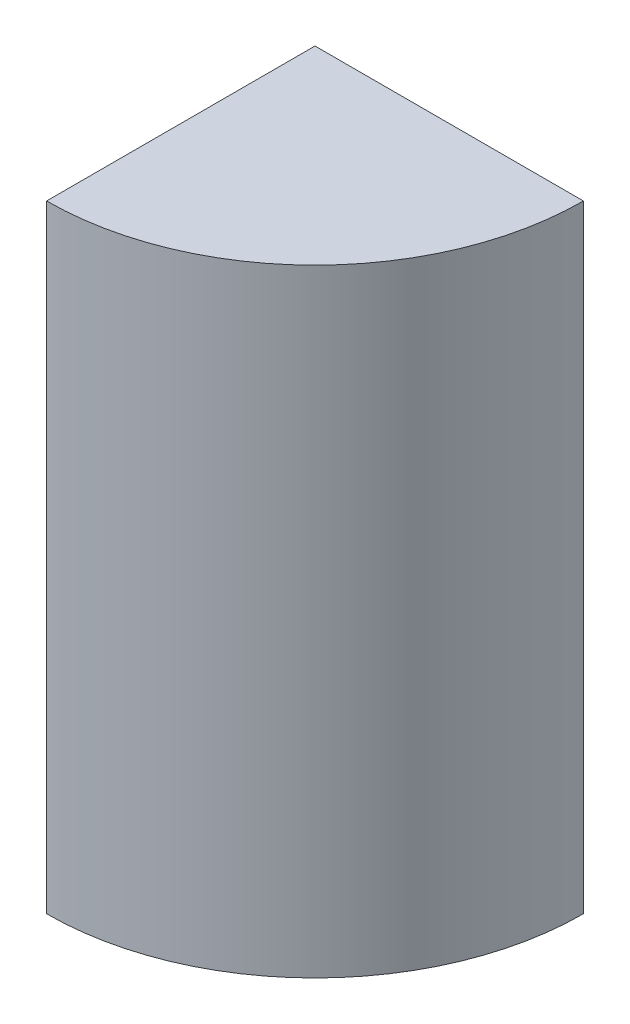
ISO-10303-21;
HEADER;
FILE_DESCRIPTION(('STEP AP214'),'2;1');
FILE_NAME('part.step','',(''),(''),'','','');
FILE_SCHEMA(('AUTOMOTIVE_DESIGN { 1 0 10303 214 1 1 1 1 }'));
ENDSEC;
DATA;
#1=APPLICATION_CONTEXT('core data for automotive mechanical design processes');
#2=APPLICATION_PROTOCOL_DEFINITION('international standard','automotive_design',2000,#1);
#3=PRODUCT_CONTEXT('',#1,'mechanical');
#4=PRODUCT('Part','Part','',(#3));
#5=PRODUCT_RELATED_PRODUCT_CATEGORY('part','',(#4));
#6=PRODUCT_DEFINITION_FORMATION('','',#4);
#7=PRODUCT_DEFINITION_CONTEXT('part definition',#1,'design');
#8=PRODUCT_DEFINITION('design','',#6,#7);
#9=PRODUCT_DEFINITION_SHAPE('','',#8);
#10=(LENGTH_UNIT() NAMED_UNIT(*) SI_UNIT(.MILLI.,.METRE.));
#11=(NAMED_UNIT(*) PLANE_ANGLE_UNIT() SI_UNIT($,.RADIAN.));
#12=(NAMED_UNIT(*) SI_UNIT($,.STERADIAN.) SOLID_ANGLE_UNIT());
#13=UNCERTAINTY_MEASURE_WITH_UNIT(LENGTH_MEASURE(1.E-05),#10,'distance_accuracy_value','');
#14=(GEOMETRIC_REPRESENTATION_CONTEXT(3) GLOBAL_UNCERTAINTY_ASSIGNED_CONTEXT((#13)) GLOBAL_UNIT_ASSIGNED_CONTEXT((#10,
#11,#12)) REPRESENTATION_CONTEXT('',''));
#15=CARTESIAN_POINT('',(0.,0.,0.));
#16=DIRECTION('',(0.,0.,1.));
#17=DIRECTION('',(1.,0.,0.));
#18=AXIS2_PLACEMENT_3D('',#15,#16,#17);
#19=CARTESIAN_POINT('',(0.,584.2,0.));
#20=DIRECTION('',(0.,-1.,0.));
#21=DIRECTION('',(0.,0.,-1.));
#22=AXIS2_PLACEMENT_3D('',#19,#20,#21);
#23=CYLINDRICAL_SURFACE('',#22,254.);
#24=CARTESIAN_POINT('',(0.,0.,0.));
#25=DIRECTION('',(0.,1.,0.));
#26=DIRECTION('',(0.,0.,1.));
#27=AXIS2_PLACEMENT_3D('',#24,#25,#26);
#28=CIRCLE('',#27,254.);
#29=CARTESIAN_POINT('',(254.,0.,0.));
#30=VERTEX_POINT('',#29);
#31=CARTESIAN_POINT('',(0.,0.,254.));
#32=VERTEX_POINT('',#31);
#33=EDGE_CURVE('E76',#30,#32,#28,.F.);
#34=ORIENTED_EDGE('',*,*,#33,.F.);
#35=DIRECTION('',(0.,-1.,0.));
#36=VECTOR('',#35,1.);
#37=CARTESIAN_POINT('',(254.,584.2,0.));
#38=LINE('',#37,#36);
#39=CARTESIAN_POINT('',(254.,584.2,0.));
#40=VERTEX_POINT('',#39);
#41=EDGE_CURVE('E11',#40,#30,#38,.T.);
#42=ORIENTED_EDGE('',*,*,#41,.F.);
#43=CARTESIAN_POINT('',(0.,584.2,0.));
#44=DIRECTION('',(0.,1.,0.));
#45=DIRECTION('',(0.,0.,1.));
#46=AXIS2_PLACEMENT_3D('',#43,#44,#45);
#47=CIRCLE('',#46,254.);
#48=CARTESIAN_POINT('',(0.,584.2,254.));
#49=VERTEX_POINT('',#48);
#50=EDGE_CURVE('E74',#40,#49,#47,.F.);
#51=ORIENTED_EDGE('',*,*,#50,.T.);
#52=DIRECTION('',(0.,-1.,0.));
#53=VECTOR('',#52,1.);
#54=CARTESIAN_POINT('',(0.,584.2,254.));
#55=LINE('',#54,#53);
#56=EDGE_CURVE('E72',#49,#32,#55,.T.);
#57=ORIENTED_EDGE('',*,*,#56,.T.);
#58=EDGE_LOOP('',(#34,#42,#51,#57));
#59=FACE_BOUND('',#58,.T.);
#60=ADVANCED_FACE('F39',(#59),#23,.T.);
#61=CARTESIAN_POINT('',(0.,584.2,0.));
#62=DIRECTION('',(0.,0.,-1.));
#63=DIRECTION('',(-1.,0.,0.));
#64=AXIS2_PLACEMENT_3D('',#61,#62,#63);
#65=PLANE('',#64);
#66=DIRECTION('',(1.,0.,0.));
#67=VECTOR('',#66,1.);
#68=CARTESIAN_POINT('',(0.,0.,0.));
#69=LINE('',#68,#67);
#70=CARTESIAN_POINT('',(0.,0.,0.));
#71=VERTEX_POINT('',#70);
#72=EDGE_CURVE('E90',#71,#30,#69,.T.);
#73=ORIENTED_EDGE('',*,*,#72,.F.);
#74=DIRECTION('',(0.,-1.,0.));
#75=VECTOR('',#74,1.);
#76=CARTESIAN_POINT('',(0.,584.2,0.));
#77=LINE('',#76,#75);
#78=CARTESIAN_POINT('',(0.,584.2,0.));
#79=VERTEX_POINT('',#78);
#80=EDGE_CURVE('E47',#79,#71,#77,.T.);
#81=ORIENTED_EDGE('',*,*,#80,.F.);
#82=DIRECTION('',(1.,0.,0.));
#83=VECTOR('',#82,1.);
#84=CARTESIAN_POINT('',(0.,584.2,0.));
#85=LINE('',#84,#83);
#86=EDGE_CURVE('E82',#79,#40,#85,.T.);
#87=ORIENTED_EDGE('',*,*,#86,.T.);
#88=ORIENTED_EDGE('',*,*,#41,.T.);
#89=EDGE_LOOP('',(#73,#81,#87,#88));
#90=FACE_BOUND('',#89,.T.);
#91=ADVANCED_FACE('F85',(#90),#65,.T.);
#92=CARTESIAN_POINT('',(0.,584.2,0.));
#93=DIRECTION('',(1.,0.,0.));
#94=DIRECTION('',(0.,0.,-1.));
#95=AXIS2_PLACEMENT_3D('',#92,#93,#94);
#96=PLANE('',#95);
#97=DIRECTION('',(0.,0.,1.));
#98=VECTOR('',#97,1.);
#99=CARTESIAN_POINT('',(0.,0.,0.));
#100=LINE('',#99,#98);
#101=EDGE_CURVE('E83',#71,#32,#100,.T.);
#102=ORIENTED_EDGE('',*,*,#101,.T.);
#103=ORIENTED_EDGE('',*,*,#56,.F.);
#104=DIRECTION('',(0.,0.,1.));
#105=VECTOR('',#104,1.);
#106=CARTESIAN_POINT('',(0.,584.2,0.));
#107=LINE('',#106,#105);
#108=EDGE_CURVE('E55',#79,#49,#107,.T.);
#109=ORIENTED_EDGE('',*,*,#108,.F.);
#110=ORIENTED_EDGE('',*,*,#80,.T.);
#111=EDGE_LOOP('',(#102,#103,#109,#110));
#112=FACE_BOUND('',#111,.T.);
#113=ADVANCED_FACE('F93',(#112),#96,.F.);
#114=CARTESIAN_POINT('',(0.,584.2,0.));
#115=DIRECTION('',(0.,1.,0.));
#116=DIRECTION('',(0.,0.,1.));
#117=AXIS2_PLACEMENT_3D('',#114,#115,#116);
#118=PLANE('',#117);
#119=ORIENTED_EDGE('',*,*,#50,.F.);
#120=ORIENTED_EDGE('',*,*,#86,.F.);
#121=ORIENTED_EDGE('',*,*,#108,.T.);
#122=EDGE_LOOP('',(#119,#120,#121));
#123=FACE_BOUND('',#122,.T.);
#124=ADVANCED_FACE('F81',(#123),#118,.T.);
#125=CARTESIAN_POINT('',(0.,0.,0.));
#126=DIRECTION('',(0.,1.,0.));
#127=DIRECTION('',(0.,0.,1.));
#128=AXIS2_PLACEMENT_3D('',#125,#126,#127);
#129=PLANE('',#128);
#130=ORIENTED_EDGE('',*,*,#33,.T.);
#131=ORIENTED_EDGE('',*,*,#101,.F.);
#132=ORIENTED_EDGE('',*,*,#72,.T.);
#133=EDGE_LOOP('',(#130,#131,#132));
#134=FACE_BOUND('',#133,.T.);
#135=ADVANCED_FACE('F95',(#134),#129,.F.);
#136=CLOSED_SHELL('',(#60,#91,#113,#124,#135));
#137=MANIFOLD_SOLID_BREP('B2',#136);
#138=ADVANCED_BREP_SHAPE_REPRESENTATION('',(#18,#137),#14);
#139=SHAPE_DEFINITION_REPRESENTATION(#9,#138);
ENDSEC;
END-ISO-10303-21;
